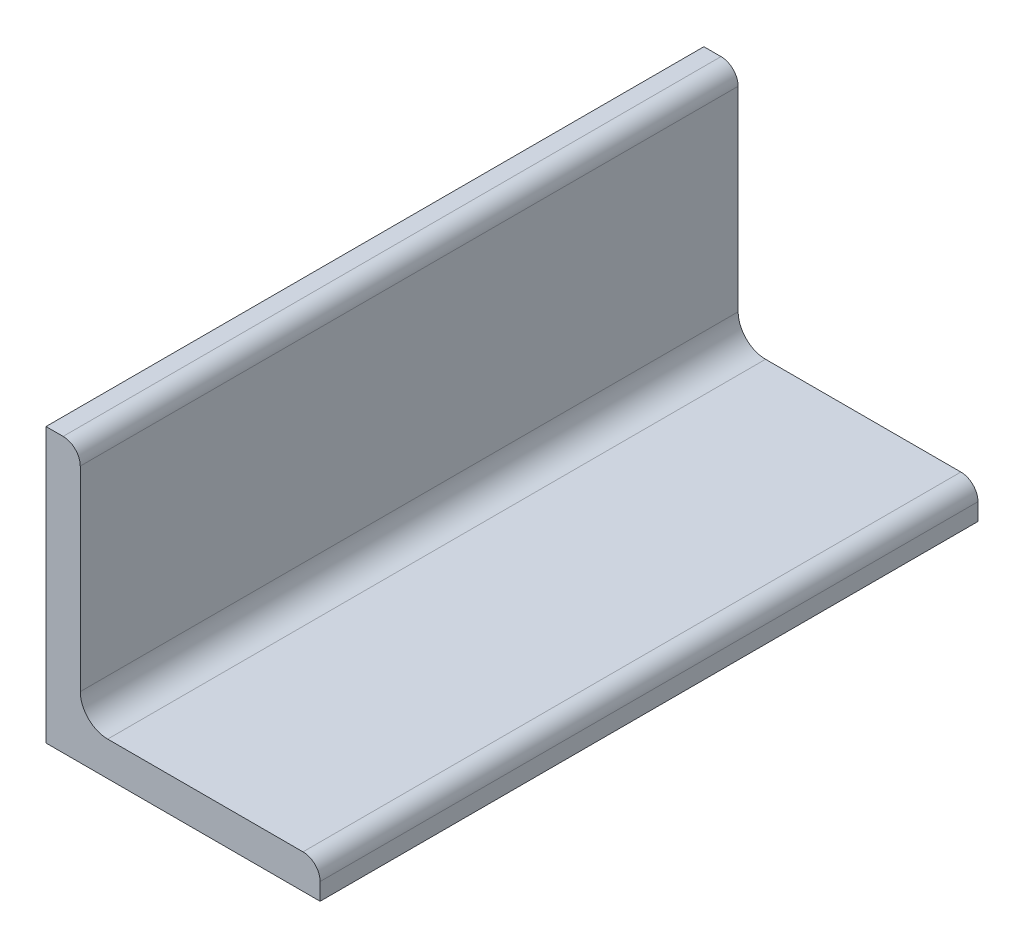
ISO-10303-21;
HEADER;
FILE_DESCRIPTION(('STEP AP214'),'2;1');
FILE_NAME('part.step','',(''),(''),'','','');
FILE_SCHEMA(('AUTOMOTIVE_DESIGN { 1 0 10303 214 1 1 1 1 }'));
ENDSEC;
DATA;
#1=APPLICATION_CONTEXT('core data for automotive mechanical design processes');
#2=APPLICATION_PROTOCOL_DEFINITION('international standard','automotive_design',2000,#1);
#3=PRODUCT_CONTEXT('',#1,'mechanical');
#4=PRODUCT('Part','Part','',(#3));
#5=PRODUCT_RELATED_PRODUCT_CATEGORY('part','',(#4));
#6=PRODUCT_DEFINITION_FORMATION('','',#4);
#7=PRODUCT_DEFINITION_CONTEXT('part definition',#1,'design');
#8=PRODUCT_DEFINITION('design','',#6,#7);
#9=PRODUCT_DEFINITION_SHAPE('','',#8);
#10=(LENGTH_UNIT() NAMED_UNIT(*) SI_UNIT(.MILLI.,.METRE.));
#11=(NAMED_UNIT(*) PLANE_ANGLE_UNIT() SI_UNIT($,.RADIAN.));
#12=(NAMED_UNIT(*) SI_UNIT($,.STERADIAN.) SOLID_ANGLE_UNIT());
#13=UNCERTAINTY_MEASURE_WITH_UNIT(LENGTH_MEASURE(1.E-05),#10,'distance_accuracy_value','');
#14=(GEOMETRIC_REPRESENTATION_CONTEXT(3) GLOBAL_UNCERTAINTY_ASSIGNED_CONTEXT((#13)) GLOBAL_UNIT_ASSIGNED_CONTEXT((#10,
#11,#12)) REPRESENTATION_CONTEXT('',''));
#15=CARTESIAN_POINT('',(0.,0.,0.));
#16=DIRECTION('',(0.,0.,1.));
#17=DIRECTION('',(1.,0.,0.));
#18=AXIS2_PLACEMENT_3D('',#15,#16,#17);
#19=CARTESIAN_POINT('',(0.0507450451214936,127.041655270204,304.8));
#20=DIRECTION('',(1.,0.,0.));
#21=DIRECTION('',(0.,0.,-1.));
#22=AXIS2_PLACEMENT_3D('',#19,#20,#21);
#23=PLANE('',#22);
#24=DIRECTION('',(0.,-1.,0.));
#25=VECTOR('',#24,1.);
#26=CARTESIAN_POINT('',(0.0507450451214936,127.041655270204,0.));
#27=LINE('',#26,#25);
#28=CARTESIAN_POINT('',(0.0507450451214936,127.041655270204,0.));
#29=VERTEX_POINT('',#28);
#30=CARTESIAN_POINT('',(0.0507450451214936,0.0416552702040917,0.));
#31=VERTEX_POINT('',#30);
#32=EDGE_CURVE('E135',#29,#31,#27,.T.);
#33=ORIENTED_EDGE('',*,*,#32,.T.);
#34=DIRECTION('',(0.,0.,-1.));
#35=VECTOR('',#34,1.);
#36=CARTESIAN_POINT('',(0.0507450451214936,0.0416552702040917,304.8));
#37=LINE('',#36,#35);
#38=CARTESIAN_POINT('',(0.0507450451214936,0.0416552702040917,304.8));
#39=VERTEX_POINT('',#38);
#40=EDGE_CURVE('E11',#39,#31,#37,.T.);
#41=ORIENTED_EDGE('',*,*,#40,.F.);
#42=DIRECTION('',(0.,-1.,0.));
#43=VECTOR('',#42,1.);
#44=CARTESIAN_POINT('',(0.0507450451214936,127.041655270204,304.8));
#45=LINE('',#44,#43);
#46=CARTESIAN_POINT('',(0.0507450451214936,127.041655270204,304.8));
#47=VERTEX_POINT('',#46);
#48=EDGE_CURVE('E151',#47,#39,#45,.T.);
#49=ORIENTED_EDGE('',*,*,#48,.F.);
#50=DIRECTION('',(0.,0.,-1.));
#51=VECTOR('',#50,1.);
#52=CARTESIAN_POINT('',(0.0507450451214936,127.041655270204,304.8));
#53=LINE('',#52,#51);
#54=EDGE_CURVE('E131',#47,#29,#53,.T.);
#55=ORIENTED_EDGE('',*,*,#54,.T.);
#56=EDGE_LOOP('',(#33,#41,#49,#55));
#57=FACE_BOUND('',#56,.T.);
#58=ADVANCED_FACE('F33',(#57),#23,.F.);
#59=CARTESIAN_POINT('',(0.0507450451214936,0.0416552702040917,304.8));
#60=DIRECTION('',(0.,1.,0.));
#61=DIRECTION('',(0.,0.,1.));
#62=AXIS2_PLACEMENT_3D('',#59,#60,#61);
#63=PLANE('',#62);
#64=DIRECTION('',(1.,0.,0.));
#65=VECTOR('',#64,1.);
#66=CARTESIAN_POINT('',(0.0507450451214936,0.0416552702040917,0.));
#67=LINE('',#66,#65);
#68=CARTESIAN_POINT('',(127.050745045121,0.0416552702040917,0.));
#69=VERTEX_POINT('',#68);
#70=EDGE_CURVE('E138',#31,#69,#67,.T.);
#71=ORIENTED_EDGE('',*,*,#70,.T.);
#72=DIRECTION('',(0.,0.,-1.));
#73=VECTOR('',#72,1.);
#74=CARTESIAN_POINT('',(127.050745045121,0.0416552702040917,304.8));
#75=LINE('',#74,#73);
#76=CARTESIAN_POINT('',(127.050745045121,0.0416552702040917,304.8));
#77=VERTEX_POINT('',#76);
#78=EDGE_CURVE('E41',#77,#69,#75,.T.);
#79=ORIENTED_EDGE('',*,*,#78,.F.);
#80=DIRECTION('',(1.,0.,0.));
#81=VECTOR('',#80,1.);
#82=CARTESIAN_POINT('',(0.0507450451214936,0.0416552702040917,304.8));
#83=LINE('',#82,#81);
#84=EDGE_CURVE('E95',#39,#77,#83,.T.);
#85=ORIENTED_EDGE('',*,*,#84,.F.);
#86=ORIENTED_EDGE('',*,*,#40,.T.);
#87=EDGE_LOOP('',(#71,#79,#85,#86));
#88=FACE_BOUND('',#87,.T.);
#89=ADVANCED_FACE('F194',(#88),#63,.F.);
#90=CARTESIAN_POINT('',(127.050745045121,0.0416552702040917,304.8));
#91=DIRECTION('',(-1.,0.,0.));
#92=DIRECTION('',(0.,0.,1.));
#93=AXIS2_PLACEMENT_3D('',#90,#91,#92);
#94=PLANE('',#93);
#95=DIRECTION('',(0.,1.,0.));
#96=VECTOR('',#95,1.);
#97=CARTESIAN_POINT('',(127.050745045121,0.0416552702040917,0.));
#98=LINE('',#97,#96);
#99=CARTESIAN_POINT('',(127.050745045121,7.97915527020409,0.));
#100=VERTEX_POINT('',#99);
#101=EDGE_CURVE('E140',#69,#100,#98,.T.);
#102=ORIENTED_EDGE('',*,*,#101,.T.);
#103=DIRECTION('',(0.,0.,-1.));
#104=VECTOR('',#103,1.);
#105=CARTESIAN_POINT('',(127.050745045121,7.97915527020409,304.8));
#106=LINE('',#105,#104);
#107=CARTESIAN_POINT('',(127.050745045121,7.97915527020409,304.8));
#108=VERTEX_POINT('',#107);
#109=EDGE_CURVE('E161',#108,#100,#106,.T.);
#110=ORIENTED_EDGE('',*,*,#109,.F.);
#111=DIRECTION('',(0.,1.,0.));
#112=VECTOR('',#111,1.);
#113=CARTESIAN_POINT('',(127.050745045121,0.0416552702040917,304.8));
#114=LINE('',#113,#112);
#115=EDGE_CURVE('E169',#77,#108,#114,.T.);
#116=ORIENTED_EDGE('',*,*,#115,.F.);
#117=ORIENTED_EDGE('',*,*,#78,.T.);
#118=EDGE_LOOP('',(#102,#110,#116,#117));
#119=FACE_BOUND('',#118,.T.);
#120=ADVANCED_FACE('F167',(#119),#94,.F.);
#121=CARTESIAN_POINT('',(119.113245045121,7.97915527020409,304.8));
#122=DIRECTION('',(0.,0.,-1.));
#123=DIRECTION('',(-1.,0.,0.));
#124=AXIS2_PLACEMENT_3D('',#121,#122,#123);
#125=CYLINDRICAL_SURFACE('',#124,7.9375);
#126=CARTESIAN_POINT('',(119.113245045121,7.97915527020409,0.));
#127=DIRECTION('',(0.,0.,1.));
#128=DIRECTION('',(1.,0.,0.));
#129=AXIS2_PLACEMENT_3D('',#126,#127,#128);
#130=CIRCLE('',#129,7.9375);
#131=CARTESIAN_POINT('',(119.113245045121,15.9166552702041,0.));
#132=VERTEX_POINT('',#131);
#133=EDGE_CURVE('E142',#100,#132,#130,.T.);
#134=ORIENTED_EDGE('',*,*,#133,.T.);
#135=DIRECTION('',(0.,0.,-1.));
#136=VECTOR('',#135,1.);
#137=CARTESIAN_POINT('',(119.113245045121,15.9166552702041,304.8));
#138=LINE('',#137,#136);
#139=CARTESIAN_POINT('',(119.113245045121,15.9166552702041,304.8));
#140=VERTEX_POINT('',#139);
#141=EDGE_CURVE('E158',#140,#132,#138,.T.);
#142=ORIENTED_EDGE('',*,*,#141,.F.);
#143=CARTESIAN_POINT('',(119.113245045121,7.97915527020409,304.8));
#144=DIRECTION('',(0.,0.,1.));
#145=DIRECTION('',(1.,0.,0.));
#146=AXIS2_PLACEMENT_3D('',#143,#144,#145);
#147=CIRCLE('',#146,7.9375);
#148=EDGE_CURVE('E185',#108,#140,#147,.T.);
#149=ORIENTED_EDGE('',*,*,#148,.F.);
#150=ORIENTED_EDGE('',*,*,#109,.T.);
#151=EDGE_LOOP('',(#134,#142,#149,#150));
#152=FACE_BOUND('',#151,.T.);
#153=ADVANCED_FACE('F178',(#152),#125,.T.);
#154=CARTESIAN_POINT('',(119.113245045121,15.9166552702041,304.8));
#155=DIRECTION('',(0.,-1.,0.));
#156=DIRECTION('',(0.,0.,-1.));
#157=AXIS2_PLACEMENT_3D('',#154,#155,#156);
#158=PLANE('',#157);
#159=DIRECTION('',(-1.,0.,0.));
#160=VECTOR('',#159,1.);
#161=CARTESIAN_POINT('',(119.113245045121,15.9166552702041,0.));
#162=LINE('',#161,#160);
#163=CARTESIAN_POINT('',(28.6257450451215,15.9166552702041,0.));
#164=VERTEX_POINT('',#163);
#165=EDGE_CURVE('E144',#132,#164,#162,.T.);
#166=ORIENTED_EDGE('',*,*,#165,.T.);
#167=DIRECTION('',(0.,0.,-1.));
#168=VECTOR('',#167,1.);
#169=CARTESIAN_POINT('',(28.6257450451215,15.9166552702041,304.8));
#170=LINE('',#169,#168);
#171=CARTESIAN_POINT('',(28.6257450451215,15.9166552702041,304.8));
#172=VERTEX_POINT('',#171);
#173=EDGE_CURVE('E155',#172,#164,#170,.T.);
#174=ORIENTED_EDGE('',*,*,#173,.F.);
#175=DIRECTION('',(-1.,0.,0.));
#176=VECTOR('',#175,1.);
#177=CARTESIAN_POINT('',(119.113245045121,15.9166552702041,304.8));
#178=LINE('',#177,#176);
#179=EDGE_CURVE('E184',#140,#172,#178,.T.);
#180=ORIENTED_EDGE('',*,*,#179,.F.);
#181=ORIENTED_EDGE('',*,*,#141,.T.);
#182=EDGE_LOOP('',(#166,#174,#180,#181));
#183=FACE_BOUND('',#182,.T.);
#184=ADVANCED_FACE('F182',(#183),#158,.F.);
#185=CARTESIAN_POINT('',(28.6257450451215,28.6166552702041,304.8));
#186=DIRECTION('',(0.,0.,-1.));
#187=DIRECTION('',(-1.,0.,0.));
#188=AXIS2_PLACEMENT_3D('',#185,#186,#187);
#189=CYLINDRICAL_SURFACE('',#188,12.7);
#190=CARTESIAN_POINT('',(28.6257450451215,28.6166552702041,0.));
#191=DIRECTION('',(0.,0.,-1.));
#192=DIRECTION('',(1.,0.,0.));
#193=AXIS2_PLACEMENT_3D('',#190,#191,#192);
#194=CIRCLE('',#193,12.7);
#195=CARTESIAN_POINT('',(15.9257450451215,28.6166552702041,0.));
#196=VERTEX_POINT('',#195);
#197=EDGE_CURVE('E146',#164,#196,#194,.T.);
#198=ORIENTED_EDGE('',*,*,#197,.T.);
#199=DIRECTION('',(0.,0.,-1.));
#200=VECTOR('',#199,1.);
#201=CARTESIAN_POINT('',(15.9257450451215,28.6166552702041,304.8));
#202=LINE('',#201,#200);
#203=CARTESIAN_POINT('',(15.9257450451215,28.6166552702041,304.8));
#204=VERTEX_POINT('',#203);
#205=EDGE_CURVE('E126',#204,#196,#202,.T.);
#206=ORIENTED_EDGE('',*,*,#205,.F.);
#207=CARTESIAN_POINT('',(28.6257450451215,28.6166552702041,304.8));
#208=DIRECTION('',(0.,0.,-1.));
#209=DIRECTION('',(1.,0.,0.));
#210=AXIS2_PLACEMENT_3D('',#207,#208,#209);
#211=CIRCLE('',#210,12.7);
#212=EDGE_CURVE('E117',#172,#204,#211,.T.);
#213=ORIENTED_EDGE('',*,*,#212,.F.);
#214=ORIENTED_EDGE('',*,*,#173,.T.);
#215=EDGE_LOOP('',(#198,#206,#213,#214));
#216=FACE_BOUND('',#215,.T.);
#217=ADVANCED_FACE('F206',(#216),#189,.F.);
#218=CARTESIAN_POINT('',(15.9257450451215,28.6166552702041,304.8));
#219=DIRECTION('',(-1.,0.,0.));
#220=DIRECTION('',(0.,0.,1.));
#221=AXIS2_PLACEMENT_3D('',#218,#219,#220);
#222=PLANE('',#221);
#223=DIRECTION('',(0.,1.,0.));
#224=VECTOR('',#223,1.);
#225=CARTESIAN_POINT('',(15.9257450451215,28.6166552702041,0.));
#226=LINE('',#225,#224);
#227=CARTESIAN_POINT('',(15.9257450451215,119.104155270204,0.));
#228=VERTEX_POINT('',#227);
#229=EDGE_CURVE('E125',#196,#228,#226,.T.);
#230=ORIENTED_EDGE('',*,*,#229,.T.);
#231=DIRECTION('',(0.,0.,-1.));
#232=VECTOR('',#231,1.);
#233=CARTESIAN_POINT('',(15.9257450451215,119.104155270204,304.8));
#234=LINE('',#233,#232);
#235=CARTESIAN_POINT('',(15.9257450451215,119.104155270204,304.8));
#236=VERTEX_POINT('',#235);
#237=EDGE_CURVE('E122',#236,#228,#234,.T.);
#238=ORIENTED_EDGE('',*,*,#237,.F.);
#239=DIRECTION('',(0.,1.,0.));
#240=VECTOR('',#239,1.);
#241=CARTESIAN_POINT('',(15.9257450451215,28.6166552702041,304.8));
#242=LINE('',#241,#240);
#243=EDGE_CURVE('E111',#204,#236,#242,.T.);
#244=ORIENTED_EDGE('',*,*,#243,.F.);
#245=ORIENTED_EDGE('',*,*,#205,.T.);
#246=EDGE_LOOP('',(#230,#238,#244,#245));
#247=FACE_BOUND('',#246,.T.);
#248=ADVANCED_FACE('F123',(#247),#222,.F.);
#249=CARTESIAN_POINT('',(7.9882450451215,119.104155270204,304.8));
#250=DIRECTION('',(0.,0.,-1.));
#251=DIRECTION('',(-1.,0.,0.));
#252=AXIS2_PLACEMENT_3D('',#249,#250,#251);
#253=CYLINDRICAL_SURFACE('',#252,7.9375);
#254=CARTESIAN_POINT('',(7.9882450451215,119.104155270204,0.));
#255=DIRECTION('',(0.,0.,1.));
#256=DIRECTION('',(1.,0.,0.));
#257=AXIS2_PLACEMENT_3D('',#254,#255,#256);
#258=CIRCLE('',#257,7.9375);
#259=CARTESIAN_POINT('',(7.98824504512149,127.041655270204,0.));
#260=VERTEX_POINT('',#259);
#261=EDGE_CURVE('E81',#228,#260,#258,.T.);
#262=ORIENTED_EDGE('',*,*,#261,.T.);
#263=DIRECTION('',(0.,0.,-1.));
#264=VECTOR('',#263,1.);
#265=CARTESIAN_POINT('',(7.98824504512149,127.041655270204,304.8));
#266=LINE('',#265,#264);
#267=CARTESIAN_POINT('',(7.98824504512149,127.041655270204,304.8));
#268=VERTEX_POINT('',#267);
#269=EDGE_CURVE('E127',#268,#260,#266,.T.);
#270=ORIENTED_EDGE('',*,*,#269,.F.);
#271=CARTESIAN_POINT('',(7.9882450451215,119.104155270204,304.8));
#272=DIRECTION('',(0.,0.,1.));
#273=DIRECTION('',(1.,0.,0.));
#274=AXIS2_PLACEMENT_3D('',#271,#272,#273);
#275=CIRCLE('',#274,7.9375);
#276=EDGE_CURVE('E115',#236,#268,#275,.T.);
#277=ORIENTED_EDGE('',*,*,#276,.F.);
#278=ORIENTED_EDGE('',*,*,#237,.T.);
#279=EDGE_LOOP('',(#262,#270,#277,#278));
#280=FACE_BOUND('',#279,.T.);
#281=ADVANCED_FACE('F129',(#280),#253,.T.);
#282=CARTESIAN_POINT('',(7.98824504512149,127.041655270204,304.8));
#283=DIRECTION('',(0.,-1.,0.));
#284=DIRECTION('',(0.,0.,-1.));
#285=AXIS2_PLACEMENT_3D('',#282,#283,#284);
#286=PLANE('',#285);
#287=DIRECTION('',(-1.,0.,0.));
#288=VECTOR('',#287,1.);
#289=CARTESIAN_POINT('',(7.98824504512149,127.041655270204,0.));
#290=LINE('',#289,#288);
#291=EDGE_CURVE('E87',#260,#29,#290,.T.);
#292=ORIENTED_EDGE('',*,*,#291,.T.);
#293=ORIENTED_EDGE('',*,*,#54,.F.);
#294=DIRECTION('',(-1.,0.,0.));
#295=VECTOR('',#294,1.);
#296=CARTESIAN_POINT('',(7.98824504512149,127.041655270204,304.8));
#297=LINE('',#296,#295);
#298=EDGE_CURVE('E49',#268,#47,#297,.T.);
#299=ORIENTED_EDGE('',*,*,#298,.F.);
#300=ORIENTED_EDGE('',*,*,#269,.T.);
#301=EDGE_LOOP('',(#292,#293,#299,#300));
#302=FACE_BOUND('',#301,.T.);
#303=ADVANCED_FACE('F214',(#302),#286,.F.);
#304=CARTESIAN_POINT('',(119.113245045121,7.97915527020409,304.8));
#305=DIRECTION('',(0.,0.,1.));
#306=DIRECTION('',(1.,0.,0.));
#307=AXIS2_PLACEMENT_3D('',#304,#305,#306);
#308=PLANE('',#307);
#309=ORIENTED_EDGE('',*,*,#48,.T.);
#310=ORIENTED_EDGE('',*,*,#84,.T.);
#311=ORIENTED_EDGE('',*,*,#115,.T.);
#312=ORIENTED_EDGE('',*,*,#148,.T.);
#313=ORIENTED_EDGE('',*,*,#179,.T.);
#314=ORIENTED_EDGE('',*,*,#212,.T.);
#315=ORIENTED_EDGE('',*,*,#243,.T.);
#316=ORIENTED_EDGE('',*,*,#276,.T.);
#317=ORIENTED_EDGE('',*,*,#298,.T.);
#318=EDGE_LOOP('',(#309,#310,#311,#312,#313,#314,#315,#316,#317));
#319=FACE_BOUND('',#318,.T.);
#320=ADVANCED_FACE('F113',(#319),#308,.T.);
#321=CARTESIAN_POINT('',(119.113245045121,7.97915527020409,0.));
#322=DIRECTION('',(0.,0.,1.));
#323=DIRECTION('',(1.,0.,0.));
#324=AXIS2_PLACEMENT_3D('',#321,#322,#323);
#325=PLANE('',#324);
#326=ORIENTED_EDGE('',*,*,#32,.F.);
#327=ORIENTED_EDGE('',*,*,#291,.F.);
#328=ORIENTED_EDGE('',*,*,#261,.F.);
#329=ORIENTED_EDGE('',*,*,#229,.F.);
#330=ORIENTED_EDGE('',*,*,#197,.F.);
#331=ORIENTED_EDGE('',*,*,#165,.F.);
#332=ORIENTED_EDGE('',*,*,#133,.F.);
#333=ORIENTED_EDGE('',*,*,#101,.F.);
#334=ORIENTED_EDGE('',*,*,#70,.F.);
#335=EDGE_LOOP('',(#326,#327,#328,#329,#330,#331,#332,#333,#334));
#336=FACE_BOUND('',#335,.T.);
#337=ADVANCED_FACE('F173',(#336),#325,.F.);
#338=CLOSED_SHELL('',(#58,#89,#120,#153,#184,#217,#248,#281,#303,#320,#337));
#339=MANIFOLD_SOLID_BREP('B2',#338);
#340=ADVANCED_BREP_SHAPE_REPRESENTATION('',(#18,#339),#14);
#341=SHAPE_DEFINITION_REPRESENTATION(#9,#340);
ENDSEC;
END-ISO-10303-21;
